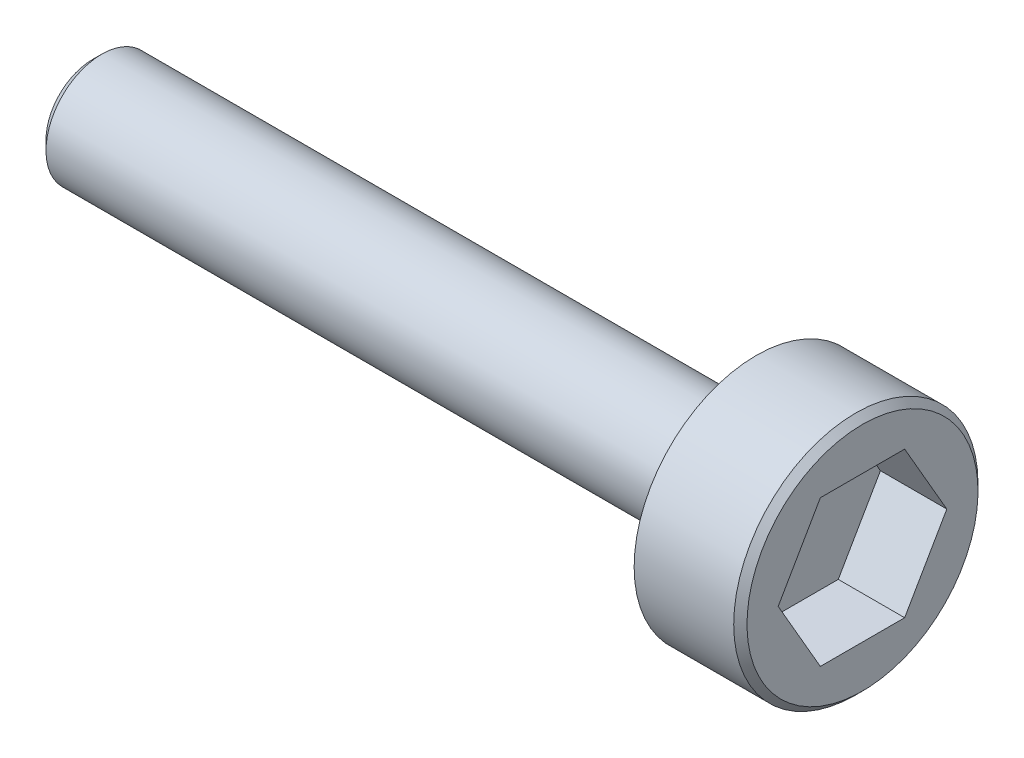
ISO-10303-21;
HEADER;
FILE_DESCRIPTION(('STEP AP214'),'2;1');
FILE_NAME('part.step','',(''),(''),'','','');
FILE_SCHEMA(('AUTOMOTIVE_DESIGN { 1 0 10303 214 1 1 1 1 }'));
ENDSEC;
DATA;
#1=APPLICATION_CONTEXT('core data for automotive mechanical design processes');
#2=APPLICATION_PROTOCOL_DEFINITION('international standard','automotive_design',2000,#1);
#3=PRODUCT_CONTEXT('',#1,'mechanical');
#4=PRODUCT('Part','Part','',(#3));
#5=PRODUCT_RELATED_PRODUCT_CATEGORY('part','',(#4));
#6=PRODUCT_DEFINITION_FORMATION('','',#4);
#7=PRODUCT_DEFINITION_CONTEXT('part definition',#1,'design');
#8=PRODUCT_DEFINITION('design','',#6,#7);
#9=PRODUCT_DEFINITION_SHAPE('','',#8);
#10=(LENGTH_UNIT() NAMED_UNIT(*) SI_UNIT(.MILLI.,.METRE.));
#11=(NAMED_UNIT(*) PLANE_ANGLE_UNIT() SI_UNIT($,.RADIAN.));
#12=(NAMED_UNIT(*) SI_UNIT($,.STERADIAN.) SOLID_ANGLE_UNIT());
#13=UNCERTAINTY_MEASURE_WITH_UNIT(LENGTH_MEASURE(1.E-05),#10,'distance_accuracy_value','');
#14=(GEOMETRIC_REPRESENTATION_CONTEXT(3) GLOBAL_UNCERTAINTY_ASSIGNED_CONTEXT((#13)) GLOBAL_UNIT_ASSIGNED_CONTEXT((#10,
#11,#12)) REPRESENTATION_CONTEXT('',''));
#15=CARTESIAN_POINT('',(0.,0.,0.));
#16=DIRECTION('',(0.,0.,1.));
#17=DIRECTION('',(1.,0.,0.));
#18=AXIS2_PLACEMENT_3D('',#15,#16,#17);
#19=CARTESIAN_POINT('',(4.,4.35,0.));
#20=DIRECTION('',(1.,0.,0.));
#21=DIRECTION('',(0.,1.,0.));
#22=AXIS2_PLACEMENT_3D('',#19,#20,#21);
#23=PLANE('',#22);
#24=DIRECTION('',(0.,0.866025403784439,-0.5));
#25=VECTOR('',#24,1.);
#26=CARTESIAN_POINT('',(4.,0.,-3.17542648054294));
#27=LINE('',#26,#25);
#28=CARTESIAN_POINT('',(4.,-2.75,-1.58771324027147));
#29=VERTEX_POINT('',#28);
#30=CARTESIAN_POINT('',(4.,0.,-3.17542648054294));
#31=VERTEX_POINT('',#30);
#32=EDGE_CURVE('E61',#29,#31,#27,.T.);
#33=ORIENTED_EDGE('',*,*,#32,.F.);
#34=DIRECTION('',(0.,0.,-1.));
#35=VECTOR('',#34,1.);
#36=CARTESIAN_POINT('',(4.,-2.75,-1.58771324027147));
#37=LINE('',#36,#35);
#38=CARTESIAN_POINT('',(4.,-2.75,1.58771324027147));
#39=VERTEX_POINT('',#38);
#40=EDGE_CURVE('E156',#39,#29,#37,.T.);
#41=ORIENTED_EDGE('',*,*,#40,.F.);
#42=DIRECTION('',(0.,-0.866025403784438,-0.5));
#43=VECTOR('',#42,1.);
#44=CARTESIAN_POINT('',(4.,-2.75,1.58771324027147));
#45=LINE('',#44,#43);
#46=CARTESIAN_POINT('',(4.,0.,3.17542648054294));
#47=VERTEX_POINT('',#46);
#48=EDGE_CURVE('E127',#47,#39,#45,.T.);
#49=ORIENTED_EDGE('',*,*,#48,.F.);
#50=DIRECTION('',(0.,-0.866025403784439,0.499999999999999));
#51=VECTOR('',#50,1.);
#52=CARTESIAN_POINT('',(4.,0.,3.17542648054294));
#53=LINE('',#52,#51);
#54=CARTESIAN_POINT('',(4.,2.75,1.58771324027147));
#55=VERTEX_POINT('',#54);
#56=EDGE_CURVE('E150',#55,#47,#53,.T.);
#57=ORIENTED_EDGE('',*,*,#56,.F.);
#58=DIRECTION('',(0.,0.,1.));
#59=VECTOR('',#58,1.);
#60=CARTESIAN_POINT('',(4.,2.75,0.));
#61=LINE('',#60,#59);
#62=CARTESIAN_POINT('',(4.,2.75,-1.58771324027147));
#63=VERTEX_POINT('',#62);
#64=EDGE_CURVE('E146',#63,#55,#61,.T.);
#65=ORIENTED_EDGE('',*,*,#64,.F.);
#66=DIRECTION('',(0.,0.866025403784439,0.499999999999999));
#67=VECTOR('',#66,1.);
#68=CARTESIAN_POINT('',(4.,2.75,-1.58771324027147));
#69=LINE('',#68,#67);
#70=EDGE_CURVE('E142',#31,#63,#69,.T.);
#71=ORIENTED_EDGE('',*,*,#70,.F.);
#72=EDGE_LOOP('',(#33,#41,#49,#57,#65,#71));
#73=FACE_BOUND('',#72,.T.);
#74=CARTESIAN_POINT('',(4.,0.,0.));
#75=DIRECTION('',(1.,0.,0.));
#76=DIRECTION('',(0.,1.,0.));
#77=AXIS2_PLACEMENT_3D('',#74,#75,#76);
#78=CIRCLE('',#77,4.34999999999999);
#79=CARTESIAN_POINT('',(4.,4.35,0.));
#80=VERTEX_POINT('',#79);
#81=EDGE_CURVE('E164',#80,#80,#78,.T.);
#82=ORIENTED_EDGE('',*,*,#81,.T.);
#83=EDGE_LOOP('',(#82));
#84=FACE_BOUND('',#83,.T.);
#85=ADVANCED_FACE('F43',(#73,#84),#23,.T.);
#86=CARTESIAN_POINT('',(-25.,0.,0.));
#87=DIRECTION('',(-1.,0.,0.));
#88=DIRECTION('',(0.,-1.,0.));
#89=AXIS2_PLACEMENT_3D('',#86,#87,#88);
#90=PLANE('',#89);
#91=CARTESIAN_POINT('',(-25.,0.,0.));
#92=DIRECTION('',(1.,0.,0.));
#93=DIRECTION('',(0.,1.,0.));
#94=AXIS2_PLACEMENT_3D('',#91,#92,#93);
#95=CIRCLE('',#94,1.75);
#96=CARTESIAN_POINT('',(-25.,1.75,0.));
#97=VERTEX_POINT('',#96);
#98=EDGE_CURVE('E11',#97,#97,#95,.T.);
#99=ORIENTED_EDGE('',*,*,#98,.F.);
#100=EDGE_LOOP('',(#99));
#101=FACE_BOUND('',#100,.T.);
#102=ADVANCED_FACE('F196',(#101),#90,.T.);
#103=CARTESIAN_POINT('',(-24.65,0.,0.));
#104=DIRECTION('',(1.,0.,0.));
#105=DIRECTION('',(0.,1.,0.));
#106=AXIS2_PLACEMENT_3D('',#103,#104,#105);
#107=CONICAL_SURFACE('',#106,2.1,0.785398163397449);
#108=ORIENTED_EDGE('',*,*,#98,.T.);
#109=EDGE_LOOP('',(#108));
#110=FACE_BOUND('',#109,.T.);
#111=CARTESIAN_POINT('',(-24.65,0.,0.));
#112=DIRECTION('',(1.,0.,0.));
#113=DIRECTION('',(0.,1.,0.));
#114=AXIS2_PLACEMENT_3D('',#111,#112,#113);
#115=CIRCLE('',#114,2.1);
#116=CARTESIAN_POINT('',(-24.65,2.1,0.));
#117=VERTEX_POINT('',#116);
#118=EDGE_CURVE('E51',#117,#117,#115,.T.);
#119=ORIENTED_EDGE('',*,*,#118,.F.);
#120=EDGE_LOOP('',(#119));
#121=FACE_BOUND('',#120,.T.);
#122=ADVANCED_FACE('F194',(#110,#121),#107,.T.);
#123=CARTESIAN_POINT('',(0.,0.,0.));
#124=DIRECTION('',(1.,0.,0.));
#125=DIRECTION('',(0.,1.,0.));
#126=AXIS2_PLACEMENT_3D('',#123,#124,#125);
#127=CYLINDRICAL_SURFACE('',#126,2.1);
#128=ORIENTED_EDGE('',*,*,#118,.T.);
#129=EDGE_LOOP('',(#128));
#130=FACE_BOUND('',#129,.T.);
#131=CARTESIAN_POINT('',(0.,0.,0.));
#132=DIRECTION('',(1.,0.,0.));
#133=DIRECTION('',(0.,1.,0.));
#134=AXIS2_PLACEMENT_3D('',#131,#132,#133);
#135=CIRCLE('',#134,2.1);
#136=CARTESIAN_POINT('',(0.,2.1,0.));
#137=VERTEX_POINT('',#136);
#138=EDGE_CURVE('E184',#137,#137,#135,.T.);
#139=ORIENTED_EDGE('',*,*,#138,.F.);
#140=EDGE_LOOP('',(#139));
#141=FACE_BOUND('',#140,.T.);
#142=ADVANCED_FACE('F191',(#130,#141),#127,.T.);
#143=CARTESIAN_POINT('',(0.,2.1,0.));
#144=DIRECTION('',(-1.,0.,0.));
#145=DIRECTION('',(0.,-1.,0.));
#146=AXIS2_PLACEMENT_3D('',#143,#144,#145);
#147=PLANE('',#146);
#148=ORIENTED_EDGE('',*,*,#138,.T.);
#149=EDGE_LOOP('',(#148));
#150=FACE_BOUND('',#149,.T.);
#151=CARTESIAN_POINT('',(0.,0.,0.));
#152=DIRECTION('',(1.,0.,0.));
#153=DIRECTION('',(0.,1.,0.));
#154=AXIS2_PLACEMENT_3D('',#151,#152,#153);
#155=CIRCLE('',#154,4.6);
#156=CARTESIAN_POINT('',(0.,4.6,0.));
#157=VERTEX_POINT('',#156);
#158=EDGE_CURVE('E180',#157,#157,#155,.T.);
#159=ORIENTED_EDGE('',*,*,#158,.F.);
#160=EDGE_LOOP('',(#159));
#161=FACE_BOUND('',#160,.T.);
#162=ADVANCED_FACE('F203',(#150,#161),#147,.T.);
#163=CARTESIAN_POINT('',(0.,0.,0.));
#164=DIRECTION('',(1.,0.,0.));
#165=DIRECTION('',(0.,1.,0.));
#166=AXIS2_PLACEMENT_3D('',#163,#164,#165);
#167=CYLINDRICAL_SURFACE('',#166,4.6);
#168=ORIENTED_EDGE('',*,*,#158,.T.);
#169=EDGE_LOOP('',(#168));
#170=FACE_BOUND('',#169,.T.);
#171=CARTESIAN_POINT('',(3.75,0.,0.));
#172=DIRECTION('',(1.,0.,0.));
#173=DIRECTION('',(0.,1.,0.));
#174=AXIS2_PLACEMENT_3D('',#171,#172,#173);
#175=CIRCLE('',#174,4.59999999999999);
#176=CARTESIAN_POINT('',(3.75,4.6,0.));
#177=VERTEX_POINT('',#176);
#178=EDGE_CURVE('E176',#177,#177,#175,.T.);
#179=ORIENTED_EDGE('',*,*,#178,.F.);
#180=EDGE_LOOP('',(#179));
#181=FACE_BOUND('',#180,.T.);
#182=ADVANCED_FACE('F217',(#170,#181),#167,.T.);
#183=CARTESIAN_POINT('',(4.,0.,0.));
#184=DIRECTION('',(-1.,0.,0.));
#185=DIRECTION('',(0.,-1.,0.));
#186=AXIS2_PLACEMENT_3D('',#183,#184,#185);
#187=CONICAL_SURFACE('',#186,4.34999999999999,0.785398163397449);
#188=ORIENTED_EDGE('',*,*,#178,.T.);
#189=EDGE_LOOP('',(#188));
#190=FACE_BOUND('',#189,.T.);
#191=ORIENTED_EDGE('',*,*,#81,.F.);
#192=EDGE_LOOP('',(#191));
#193=FACE_BOUND('',#192,.T.);
#194=ADVANCED_FACE('F214',(#190,#193),#187,.T.);
#195=CARTESIAN_POINT('',(1.5,0.,-3.17542648054294));
#196=DIRECTION('',(0.,-0.5,-0.866025403784438));
#197=DIRECTION('',(0.,0.866025403784439,-0.5));
#198=AXIS2_PLACEMENT_3D('',#195,#196,#197);
#199=PLANE('',#198);
#200=ORIENTED_EDGE('',*,*,#32,.T.);
#201=DIRECTION('',(1.,0.,0.));
#202=VECTOR('',#201,1.);
#203=CARTESIAN_POINT('',(1.5,0.,-3.17542648054294));
#204=LINE('',#203,#202);
#205=CARTESIAN_POINT('',(1.5,0.,-3.17542648054294));
#206=VERTEX_POINT('',#205);
#207=EDGE_CURVE('E161',#206,#31,#204,.T.);
#208=ORIENTED_EDGE('',*,*,#207,.F.);
#209=DIRECTION('',(0.,0.866025403784438,-0.5));
#210=VECTOR('',#209,1.);
#211=CARTESIAN_POINT('',(1.5,-1.375,-2.38156986040721));
#212=LINE('',#211,#210);
#213=CARTESIAN_POINT('',(1.5,-2.75,-1.58771324027147));
#214=VERTEX_POINT('',#213);
#215=EDGE_CURVE('E71',#214,#206,#212,.T.);
#216=ORIENTED_EDGE('',*,*,#215,.F.);
#217=DIRECTION('',(1.,0.,0.));
#218=VECTOR('',#217,1.);
#219=CARTESIAN_POINT('',(1.5,-2.75,-1.58771324027147));
#220=LINE('',#219,#218);
#221=EDGE_CURVE('E95',#214,#29,#220,.T.);
#222=ORIENTED_EDGE('',*,*,#221,.T.);
#223=EDGE_LOOP('',(#200,#208,#216,#222));
#224=FACE_BOUND('',#223,.T.);
#225=ADVANCED_FACE('F216',(#224),#199,.F.);
#226=CARTESIAN_POINT('',(1.5,-2.75,-1.58771324027147));
#227=DIRECTION('',(0.,-1.,0.));
#228=DIRECTION('',(1.,0.,0.));
#229=AXIS2_PLACEMENT_3D('',#226,#227,#228);
#230=PLANE('',#229);
#231=ORIENTED_EDGE('',*,*,#40,.T.);
#232=ORIENTED_EDGE('',*,*,#221,.F.);
#233=DIRECTION('',(0.,0.,-1.));
#234=VECTOR('',#233,1.);
#235=CARTESIAN_POINT('',(1.5,-2.75,0.));
#236=LINE('',#235,#234);
#237=CARTESIAN_POINT('',(1.5,-2.75,1.58771324027147));
#238=VERTEX_POINT('',#237);
#239=EDGE_CURVE('E116',#238,#214,#236,.T.);
#240=ORIENTED_EDGE('',*,*,#239,.F.);
#241=DIRECTION('',(1.,0.,0.));
#242=VECTOR('',#241,1.);
#243=CARTESIAN_POINT('',(1.5,-2.75,1.58771324027147));
#244=LINE('',#243,#242);
#245=EDGE_CURVE('E124',#238,#39,#244,.T.);
#246=ORIENTED_EDGE('',*,*,#245,.T.);
#247=EDGE_LOOP('',(#231,#232,#240,#246));
#248=FACE_BOUND('',#247,.T.);
#249=ADVANCED_FACE('F133',(#248),#230,.F.);
#250=CARTESIAN_POINT('',(1.5,-2.75,1.58771324027147));
#251=DIRECTION('',(0.,-0.5,0.866025403784438));
#252=DIRECTION('',(0.,-0.866025403784438,-0.5));
#253=AXIS2_PLACEMENT_3D('',#250,#251,#252);
#254=PLANE('',#253);
#255=ORIENTED_EDGE('',*,*,#48,.T.);
#256=ORIENTED_EDGE('',*,*,#245,.F.);
#257=DIRECTION('',(0.,-0.866025403784439,-0.5));
#258=VECTOR('',#257,1.);
#259=CARTESIAN_POINT('',(1.5,-1.375,2.38156986040721));
#260=LINE('',#259,#258);
#261=CARTESIAN_POINT('',(1.5,0.,3.17542648054294));
#262=VERTEX_POINT('',#261);
#263=EDGE_CURVE('E112',#262,#238,#260,.T.);
#264=ORIENTED_EDGE('',*,*,#263,.F.);
#265=DIRECTION('',(1.,0.,0.));
#266=VECTOR('',#265,1.);
#267=CARTESIAN_POINT('',(1.5,0.,3.17542648054294));
#268=LINE('',#267,#266);
#269=EDGE_CURVE('E131',#262,#47,#268,.T.);
#270=ORIENTED_EDGE('',*,*,#269,.T.);
#271=EDGE_LOOP('',(#255,#256,#264,#270));
#272=FACE_BOUND('',#271,.T.);
#273=ADVANCED_FACE('F125',(#272),#254,.F.);
#274=CARTESIAN_POINT('',(1.5,0.,3.17542648054294));
#275=DIRECTION('',(0.,0.499999999999999,0.866025403784439));
#276=DIRECTION('',(0.,-0.866025403784439,0.499999999999999));
#277=AXIS2_PLACEMENT_3D('',#274,#275,#276);
#278=PLANE('',#277);
#279=ORIENTED_EDGE('',*,*,#56,.T.);
#280=ORIENTED_EDGE('',*,*,#269,.F.);
#281=DIRECTION('',(0.,-0.866025403784439,0.5));
#282=VECTOR('',#281,1.);
#283=CARTESIAN_POINT('',(1.5,2.75,1.58771324027147));
#284=LINE('',#283,#282);
#285=CARTESIAN_POINT('',(1.5,2.75,1.58771324027147));
#286=VERTEX_POINT('',#285);
#287=EDGE_CURVE('E118',#286,#262,#284,.T.);
#288=ORIENTED_EDGE('',*,*,#287,.F.);
#289=DIRECTION('',(1.,0.,0.));
#290=VECTOR('',#289,1.);
#291=CARTESIAN_POINT('',(1.5,2.75,1.58771324027147));
#292=LINE('',#291,#290);
#293=EDGE_CURVE('E168',#286,#55,#292,.T.);
#294=ORIENTED_EDGE('',*,*,#293,.T.);
#295=EDGE_LOOP('',(#279,#280,#288,#294));
#296=FACE_BOUND('',#295,.T.);
#297=ADVANCED_FACE('F284',(#296),#278,.F.);
#298=CARTESIAN_POINT('',(1.5,2.75,0.));
#299=DIRECTION('',(0.,1.,0.));
#300=DIRECTION('',(0.,0.,1.));
#301=AXIS2_PLACEMENT_3D('',#298,#299,#300);
#302=PLANE('',#301);
#303=ORIENTED_EDGE('',*,*,#64,.T.);
#304=ORIENTED_EDGE('',*,*,#293,.F.);
#305=DIRECTION('',(0.,0.,1.));
#306=VECTOR('',#305,1.);
#307=CARTESIAN_POINT('',(1.5,2.75,0.));
#308=LINE('',#307,#306);
#309=CARTESIAN_POINT('',(1.5,2.75,-1.58771324027147));
#310=VERTEX_POINT('',#309);
#311=EDGE_CURVE('E331',#310,#286,#308,.T.);
#312=ORIENTED_EDGE('',*,*,#311,.F.);
#313=DIRECTION('',(1.,0.,0.));
#314=VECTOR('',#313,1.);
#315=CARTESIAN_POINT('',(1.5,2.75,-1.58771324027147));
#316=LINE('',#315,#314);
#317=EDGE_CURVE('E138',#310,#63,#316,.T.);
#318=ORIENTED_EDGE('',*,*,#317,.T.);
#319=EDGE_LOOP('',(#303,#304,#312,#318));
#320=FACE_BOUND('',#319,.T.);
#321=ADVANCED_FACE('F294',(#320),#302,.F.);
#322=CARTESIAN_POINT('',(1.5,2.75,-1.58771324027147));
#323=DIRECTION('',(0.,0.5,-0.866025403784439));
#324=DIRECTION('',(0.,0.866025403784439,0.5));
#325=AXIS2_PLACEMENT_3D('',#322,#323,#324);
#326=PLANE('',#325);
#327=ORIENTED_EDGE('',*,*,#70,.T.);
#328=ORIENTED_EDGE('',*,*,#317,.F.);
#329=DIRECTION('',(0.,0.866025403784438,0.5));
#330=VECTOR('',#329,1.);
#331=CARTESIAN_POINT('',(1.5,1.375,-2.38156986040721));
#332=LINE('',#331,#330);
#333=EDGE_CURVE('E103',#206,#310,#332,.T.);
#334=ORIENTED_EDGE('',*,*,#333,.F.);
#335=ORIENTED_EDGE('',*,*,#207,.T.);
#336=EDGE_LOOP('',(#327,#328,#334,#335));
#337=FACE_BOUND('',#336,.T.);
#338=ADVANCED_FACE('F228',(#337),#326,.F.);
#339=CARTESIAN_POINT('',(1.5,0.,0.));
#340=DIRECTION('',(-1.,0.,0.));
#341=DIRECTION('',(0.,0.,1.));
#342=AXIS2_PLACEMENT_3D('',#339,#340,#341);
#343=PLANE('',#342);
#344=ORIENTED_EDGE('',*,*,#333,.T.);
#345=ORIENTED_EDGE('',*,*,#311,.T.);
#346=ORIENTED_EDGE('',*,*,#287,.T.);
#347=ORIENTED_EDGE('',*,*,#263,.T.);
#348=ORIENTED_EDGE('',*,*,#239,.T.);
#349=ORIENTED_EDGE('',*,*,#215,.T.);
#350=EDGE_LOOP('',(#344,#345,#346,#347,#348,#349));
#351=FACE_BOUND('',#350,.T.);
#352=ADVANCED_FACE('F114',(#351),#343,.F.);
#353=CLOSED_SHELL('',(#85,#102,#122,#142,#162,#182,#194,#225,#249,#273,#297,#321,#338,#352));
#354=MANIFOLD_SOLID_BREP('B2',#353);
#355=ADVANCED_BREP_SHAPE_REPRESENTATION('',(#18,#354),#14);
#356=SHAPE_DEFINITION_REPRESENTATION(#9,#355);
ENDSEC;
END-ISO-10303-21;
